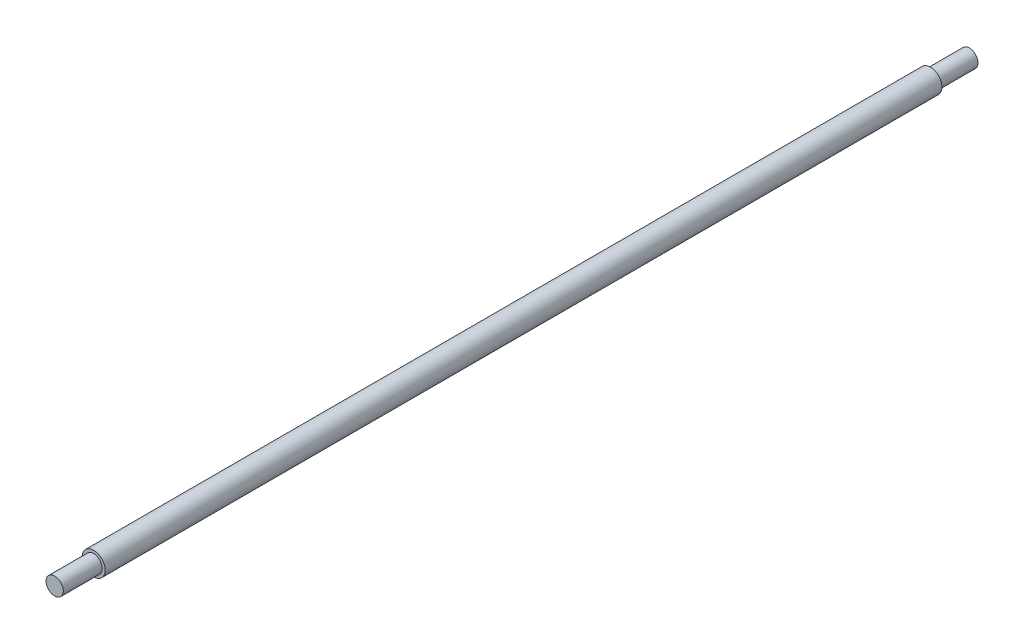
ISO-10303-21;
HEADER;
FILE_DESCRIPTION(('STEP AP214'),'2;1');
FILE_NAME('part.step','',(''),(''),'','','');
FILE_SCHEMA(('AUTOMOTIVE_DESIGN { 1 0 10303 214 1 1 1 1 }'));
ENDSEC;
DATA;
#1=APPLICATION_CONTEXT('core data for automotive mechanical design processes');
#2=APPLICATION_PROTOCOL_DEFINITION('international standard','automotive_design',2000,#1);
#3=PRODUCT_CONTEXT('',#1,'mechanical');
#4=PRODUCT('Part','Part','',(#3));
#5=PRODUCT_RELATED_PRODUCT_CATEGORY('part','',(#4));
#6=PRODUCT_DEFINITION_FORMATION('','',#4);
#7=PRODUCT_DEFINITION_CONTEXT('part definition',#1,'design');
#8=PRODUCT_DEFINITION('design','',#6,#7);
#9=PRODUCT_DEFINITION_SHAPE('','',#8);
#10=(LENGTH_UNIT() NAMED_UNIT(*) SI_UNIT(.MILLI.,.METRE.));
#11=(NAMED_UNIT(*) PLANE_ANGLE_UNIT() SI_UNIT($,.RADIAN.));
#12=(NAMED_UNIT(*) SI_UNIT($,.STERADIAN.) SOLID_ANGLE_UNIT());
#13=UNCERTAINTY_MEASURE_WITH_UNIT(LENGTH_MEASURE(1.E-05),#10,'distance_accuracy_value','');
#14=(GEOMETRIC_REPRESENTATION_CONTEXT(3) GLOBAL_UNCERTAINTY_ASSIGNED_CONTEXT((#13)) GLOBAL_UNIT_ASSIGNED_CONTEXT((#10,
#11,#12)) REPRESENTATION_CONTEXT('',''));
#15=CARTESIAN_POINT('',(0.,0.,0.));
#16=DIRECTION('',(0.,0.,1.));
#17=DIRECTION('',(1.,0.,0.));
#18=AXIS2_PLACEMENT_3D('',#15,#16,#17);
#19=CARTESIAN_POINT('',(0.,0.,158.5));
#20=DIRECTION('',(0.,0.,1.));
#21=DIRECTION('',(0.,-1.,0.));
#22=AXIS2_PLACEMENT_3D('',#19,#20,#21);
#23=PLANE('',#22);
#24=CARTESIAN_POINT('',(0.,0.,158.5));
#25=DIRECTION('',(0.,0.,-1.));
#26=DIRECTION('',(0.,1.,0.));
#27=AXIS2_PLACEMENT_3D('',#24,#25,#26);
#28=CIRCLE('',#27,3.);
#29=CARTESIAN_POINT('',(0.,2.99999999999996,158.5));
#30=VERTEX_POINT('',#29);
#31=EDGE_CURVE('E10',#30,#30,#28,.T.);
#32=ORIENTED_EDGE('',*,*,#31,.F.);
#33=EDGE_LOOP('',(#32));
#34=FACE_BOUND('',#33,.T.);
#35=ADVANCED_FACE('F34',(#34),#23,.T.);
#36=CARTESIAN_POINT('',(0.,0.,-158.5));
#37=DIRECTION('',(0.,0.,-1.));
#38=DIRECTION('',(0.,1.,0.));
#39=AXIS2_PLACEMENT_3D('',#36,#37,#38);
#40=CYLINDRICAL_SURFACE('',#39,3.);
#41=ORIENTED_EDGE('',*,*,#31,.T.);
#42=EDGE_LOOP('',(#41));
#43=FACE_BOUND('',#42,.T.);
#44=CARTESIAN_POINT('',(0.,0.,145.));
#45=DIRECTION('',(0.,0.,-1.));
#46=DIRECTION('',(0.,1.,0.));
#47=AXIS2_PLACEMENT_3D('',#44,#45,#46);
#48=CIRCLE('',#47,3.);
#49=CARTESIAN_POINT('',(0.,2.99999999999996,145.));
#50=VERTEX_POINT('',#49);
#51=EDGE_CURVE('E40',#50,#50,#48,.T.);
#52=ORIENTED_EDGE('',*,*,#51,.F.);
#53=EDGE_LOOP('',(#52));
#54=FACE_BOUND('',#53,.T.);
#55=ADVANCED_FACE('F76',(#43,#54),#40,.T.);
#56=CARTESIAN_POINT('',(0.,2.99999999999996,145.));
#57=DIRECTION('',(0.,0.,1.));
#58=DIRECTION('',(0.,-1.,0.));
#59=AXIS2_PLACEMENT_3D('',#56,#57,#58);
#60=PLANE('',#59);
#61=ORIENTED_EDGE('',*,*,#51,.T.);
#62=EDGE_LOOP('',(#61));
#63=FACE_BOUND('',#62,.T.);
#64=CARTESIAN_POINT('',(0.,0.,145.));
#65=DIRECTION('',(0.,0.,-1.));
#66=DIRECTION('',(0.,1.,0.));
#67=AXIS2_PLACEMENT_3D('',#64,#65,#66);
#68=CIRCLE('',#67,4.);
#69=CARTESIAN_POINT('',(0.,3.99999999999996,145.));
#70=VERTEX_POINT('',#69);
#71=EDGE_CURVE('E44',#70,#70,#68,.T.);
#72=ORIENTED_EDGE('',*,*,#71,.F.);
#73=EDGE_LOOP('',(#72));
#74=FACE_BOUND('',#73,.T.);
#75=ADVANCED_FACE('F81',(#63,#74),#60,.T.);
#76=CARTESIAN_POINT('',(0.,0.,-158.5));
#77=DIRECTION('',(0.,0.,-1.));
#78=DIRECTION('',(0.,1.,0.));
#79=AXIS2_PLACEMENT_3D('',#76,#77,#78);
#80=CYLINDRICAL_SURFACE('',#79,3.99999999999995);
#81=ORIENTED_EDGE('',*,*,#71,.T.);
#82=EDGE_LOOP('',(#81));
#83=FACE_BOUND('',#82,.T.);
#84=CARTESIAN_POINT('',(0.,0.,-145.));
#85=DIRECTION('',(0.,0.,-1.));
#86=DIRECTION('',(0.,1.,0.));
#87=AXIS2_PLACEMENT_3D('',#84,#85,#86);
#88=CIRCLE('',#87,3.99999999999991);
#89=CARTESIAN_POINT('',(0.,3.99999999999996,-145.));
#90=VERTEX_POINT('',#89);
#91=EDGE_CURVE('E48',#90,#90,#88,.T.);
#92=ORIENTED_EDGE('',*,*,#91,.F.);
#93=EDGE_LOOP('',(#92));
#94=FACE_BOUND('',#93,.T.);
#95=ADVANCED_FACE('F72',(#83,#94),#80,.T.);
#96=CARTESIAN_POINT('',(0.,3.99999999999996,-145.));
#97=DIRECTION('',(0.,0.,-1.));
#98=DIRECTION('',(0.,1.,0.));
#99=AXIS2_PLACEMENT_3D('',#96,#97,#98);
#100=PLANE('',#99);
#101=ORIENTED_EDGE('',*,*,#91,.T.);
#102=EDGE_LOOP('',(#101));
#103=FACE_BOUND('',#102,.T.);
#104=CARTESIAN_POINT('',(0.,0.,-145.));
#105=DIRECTION('',(0.,0.,-1.));
#106=DIRECTION('',(0.,1.,0.));
#107=AXIS2_PLACEMENT_3D('',#104,#105,#106);
#108=CIRCLE('',#107,2.99999999999994);
#109=CARTESIAN_POINT('',(0.,3.,-145.));
#110=VERTEX_POINT('',#109);
#111=EDGE_CURVE('E53',#110,#110,#108,.T.);
#112=ORIENTED_EDGE('',*,*,#111,.F.);
#113=EDGE_LOOP('',(#112));
#114=FACE_BOUND('',#113,.T.);
#115=ADVANCED_FACE('F64',(#103,#114),#100,.T.);
#116=CARTESIAN_POINT('',(0.,0.,-158.5));
#117=DIRECTION('',(0.,0.,-1.));
#118=DIRECTION('',(0.,1.,0.));
#119=AXIS2_PLACEMENT_3D('',#116,#117,#118);
#120=CYLINDRICAL_SURFACE('',#119,2.99999999999994);
#121=ORIENTED_EDGE('',*,*,#111,.T.);
#122=EDGE_LOOP('',(#121));
#123=FACE_BOUND('',#122,.T.);
#124=CARTESIAN_POINT('',(0.,0.,-158.5));
#125=DIRECTION('',(0.,0.,-1.));
#126=DIRECTION('',(0.,1.,0.));
#127=AXIS2_PLACEMENT_3D('',#124,#125,#126);
#128=CIRCLE('',#127,2.99999999999994);
#129=CARTESIAN_POINT('',(0.,3.,-158.5));
#130=VERTEX_POINT('',#129);
#131=EDGE_CURVE('E56',#130,#130,#128,.T.);
#132=ORIENTED_EDGE('',*,*,#131,.F.);
#133=EDGE_LOOP('',(#132));
#134=FACE_BOUND('',#133,.T.);
#135=ADVANCED_FACE('F62',(#123,#134),#120,.T.);
#136=CARTESIAN_POINT('',(0.,3.,-158.5));
#137=DIRECTION('',(0.,0.,-1.));
#138=DIRECTION('',(0.,1.,0.));
#139=AXIS2_PLACEMENT_3D('',#136,#137,#138);
#140=PLANE('',#139);
#141=ORIENTED_EDGE('',*,*,#131,.T.);
#142=EDGE_LOOP('',(#141));
#143=FACE_BOUND('',#142,.T.);
#144=ADVANCED_FACE('F60',(#143),#140,.T.);
#145=CLOSED_SHELL('',(#35,#55,#75,#95,#115,#135,#144));
#146=MANIFOLD_SOLID_BREP('B2',#145);
#147=ADVANCED_BREP_SHAPE_REPRESENTATION('',(#18,#146),#14);
#148=SHAPE_DEFINITION_REPRESENTATION(#9,#147);
ENDSEC;
END-ISO-10303-21;
